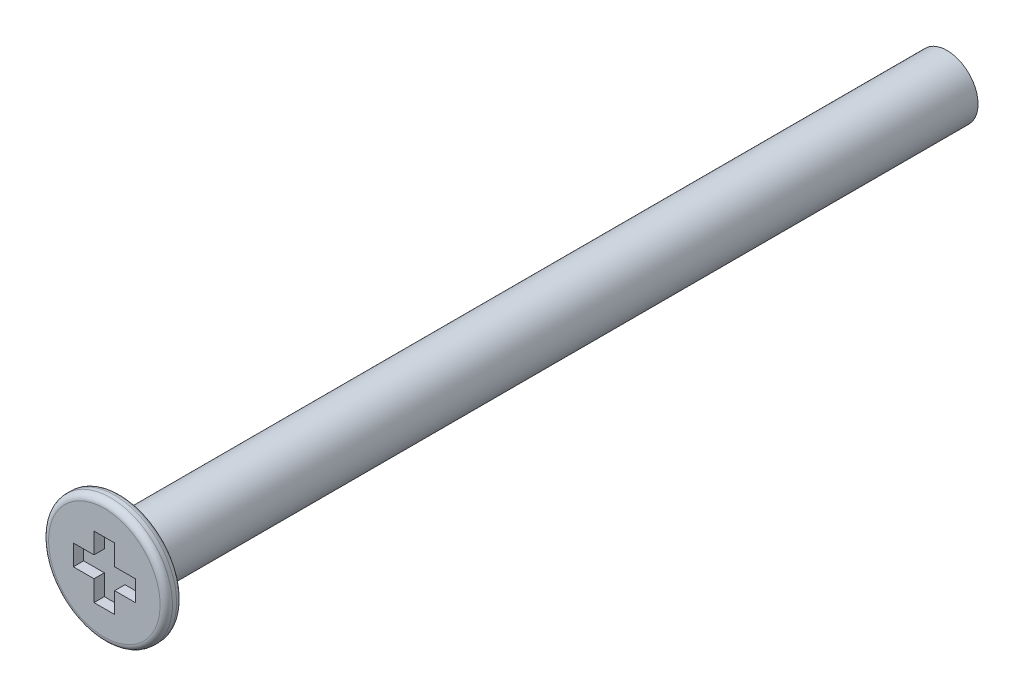
ISO-10303-21;
HEADER;
FILE_DESCRIPTION(('STEP AP214'),'2;1');
FILE_NAME('part.step','',(''),(''),'','','');
FILE_SCHEMA(('AUTOMOTIVE_DESIGN { 1 0 10303 214 1 1 1 1 }'));
ENDSEC;
DATA;
#1=APPLICATION_CONTEXT('core data for automotive mechanical design processes');
#2=APPLICATION_PROTOCOL_DEFINITION('international standard','automotive_design',2000,#1);
#3=PRODUCT_CONTEXT('',#1,'mechanical');
#4=PRODUCT('Part','Part','',(#3));
#5=PRODUCT_RELATED_PRODUCT_CATEGORY('part','',(#4));
#6=PRODUCT_DEFINITION_FORMATION('','',#4);
#7=PRODUCT_DEFINITION_CONTEXT('part definition',#1,'design');
#8=PRODUCT_DEFINITION('design','',#6,#7);
#9=PRODUCT_DEFINITION_SHAPE('','',#8);
#10=(LENGTH_UNIT() NAMED_UNIT(*) SI_UNIT(.MILLI.,.METRE.));
#11=(NAMED_UNIT(*) PLANE_ANGLE_UNIT() SI_UNIT($,.RADIAN.));
#12=(NAMED_UNIT(*) SI_UNIT($,.STERADIAN.) SOLID_ANGLE_UNIT());
#13=UNCERTAINTY_MEASURE_WITH_UNIT(LENGTH_MEASURE(1.E-05),#10,'distance_accuracy_value','');
#14=(GEOMETRIC_REPRESENTATION_CONTEXT(3) GLOBAL_UNCERTAINTY_ASSIGNED_CONTEXT((#13)) GLOBAL_UNIT_ASSIGNED_CONTEXT((#10,
#11,#12)) REPRESENTATION_CONTEXT('',''));
#15=CARTESIAN_POINT('',(0.,0.,0.));
#16=DIRECTION('',(0.,0.,1.));
#17=DIRECTION('',(1.,0.,0.));
#18=AXIS2_PLACEMENT_3D('',#15,#16,#17);
#19=CARTESIAN_POINT('',(0.,0.,0.3));
#20=DIRECTION('',(0.,0.,-1.));
#21=DIRECTION('',(0.,-1.,0.));
#22=AXIS2_PLACEMENT_3D('',#19,#20,#21);
#23=PLANE('',#22);
#24=DIRECTION('',(-1.,0.,0.));
#25=VECTOR('',#24,1.);
#26=CARTESIAN_POINT('',(0.499999988824129,-1.49999996647239,0.3));
#27=LINE('',#26,#25);
#28=CARTESIAN_POINT('',(0.499999988824129,-1.49999996647239,0.3));
#29=VERTEX_POINT('',#28);
#30=CARTESIAN_POINT('',(-0.499999988824129,-1.49999996647239,0.3));
#31=VERTEX_POINT('',#30);
#32=EDGE_CURVE('E11',#29,#31,#27,.T.);
#33=ORIENTED_EDGE('',*,*,#32,.F.);
#34=DIRECTION('',(0.,-1.,0.));
#35=VECTOR('',#34,1.);
#36=CARTESIAN_POINT('',(0.499999988824129,1.49999996647239,0.3));
#37=LINE('',#36,#35);
#38=CARTESIAN_POINT('',(0.499999988824129,-0.499999988824129,0.3));
#39=VERTEX_POINT('',#38);
#40=EDGE_CURVE('E274',#39,#29,#37,.T.);
#41=ORIENTED_EDGE('',*,*,#40,.F.);
#42=DIRECTION('',(-1.,0.,0.));
#43=VECTOR('',#42,1.);
#44=CARTESIAN_POINT('',(1.49999996647239,-0.499999988824129,0.3));
#45=LINE('',#44,#43);
#46=CARTESIAN_POINT('',(1.49999996647239,-0.499999988824129,0.3));
#47=VERTEX_POINT('',#46);
#48=EDGE_CURVE('E269',#47,#39,#45,.T.);
#49=ORIENTED_EDGE('',*,*,#48,.F.);
#50=DIRECTION('',(0.,-1.,0.));
#51=VECTOR('',#50,1.);
#52=CARTESIAN_POINT('',(1.49999996647239,0.499999988824129,0.3));
#53=LINE('',#52,#51);
#54=CARTESIAN_POINT('',(1.49999996647239,0.499999988824129,0.3));
#55=VERTEX_POINT('',#54);
#56=EDGE_CURVE('E201',#55,#47,#53,.T.);
#57=ORIENTED_EDGE('',*,*,#56,.F.);
#58=DIRECTION('',(1.,0.,0.));
#59=VECTOR('',#58,1.);
#60=CARTESIAN_POINT('',(-1.49999996647239,0.499999988824129,0.3));
#61=LINE('',#60,#59);
#62=CARTESIAN_POINT('',(0.499999988824129,0.499999988824129,0.3));
#63=VERTEX_POINT('',#62);
#64=EDGE_CURVE('E249',#63,#55,#61,.T.);
#65=ORIENTED_EDGE('',*,*,#64,.F.);
#66=DIRECTION('',(0.,-1.,0.));
#67=VECTOR('',#66,1.);
#68=CARTESIAN_POINT('',(0.499999988824129,1.49999996647239,0.3));
#69=LINE('',#68,#67);
#70=CARTESIAN_POINT('',(0.499999988824129,1.49999996647239,0.3));
#71=VERTEX_POINT('',#70);
#72=EDGE_CURVE('E298',#71,#63,#69,.T.);
#73=ORIENTED_EDGE('',*,*,#72,.F.);
#74=DIRECTION('',(1.,0.,0.));
#75=VECTOR('',#74,1.);
#76=CARTESIAN_POINT('',(-0.499999988824129,1.49999996647239,0.3));
#77=LINE('',#76,#75);
#78=CARTESIAN_POINT('',(-0.499999988824129,1.49999996647239,0.3));
#79=VERTEX_POINT('',#78);
#80=EDGE_CURVE('E305',#79,#71,#77,.T.);
#81=ORIENTED_EDGE('',*,*,#80,.F.);
#82=DIRECTION('',(0.,1.,0.));
#83=VECTOR('',#82,1.);
#84=CARTESIAN_POINT('',(-0.499999988824129,-1.49999996647239,0.3));
#85=LINE('',#84,#83);
#86=CARTESIAN_POINT('',(-0.499999988824129,0.499999988824129,0.3));
#87=VERTEX_POINT('',#86);
#88=EDGE_CURVE('E312',#87,#79,#85,.T.);
#89=ORIENTED_EDGE('',*,*,#88,.F.);
#90=DIRECTION('',(1.,0.,0.));
#91=VECTOR('',#90,1.);
#92=CARTESIAN_POINT('',(-1.49999996647239,0.499999988824129,0.3));
#93=LINE('',#92,#91);
#94=CARTESIAN_POINT('',(-1.49999996647239,0.499999988824129,0.3));
#95=VERTEX_POINT('',#94);
#96=EDGE_CURVE('E225',#95,#87,#93,.T.);
#97=ORIENTED_EDGE('',*,*,#96,.F.);
#98=DIRECTION('',(0.,1.,0.));
#99=VECTOR('',#98,1.);
#100=CARTESIAN_POINT('',(-1.49999996647239,-0.499999988824129,0.3));
#101=LINE('',#100,#99);
#102=CARTESIAN_POINT('',(-1.49999996647239,-0.499999988824129,0.3));
#103=VERTEX_POINT('',#102);
#104=EDGE_CURVE('E224',#103,#95,#101,.T.);
#105=ORIENTED_EDGE('',*,*,#104,.F.);
#106=DIRECTION('',(-1.,0.,0.));
#107=VECTOR('',#106,1.);
#108=CARTESIAN_POINT('',(1.49999996647239,-0.499999988824129,0.3));
#109=LINE('',#108,#107);
#110=CARTESIAN_POINT('',(-0.499999988824129,-0.499999988824129,0.3));
#111=VERTEX_POINT('',#110);
#112=EDGE_CURVE('E284',#111,#103,#109,.T.);
#113=ORIENTED_EDGE('',*,*,#112,.F.);
#114=DIRECTION('',(0.,1.,0.));
#115=VECTOR('',#114,1.);
#116=CARTESIAN_POINT('',(-0.499999988824129,-1.49999996647239,0.3));
#117=LINE('',#116,#115);
#118=EDGE_CURVE('E27',#31,#111,#117,.T.);
#119=ORIENTED_EDGE('',*,*,#118,.F.);
#120=EDGE_LOOP('',(#33,#41,#49,#57,#65,#73,#81,#89,#97,#105,#113,#119));
#121=FACE_BOUND('',#120,.T.);
#122=ADVANCED_FACE('F17',(#121),#23,.F.);
#123=CARTESIAN_POINT('',(0.499999988824129,-1.49999996647239,0.8));
#124=DIRECTION('',(0.,-1.,0.));
#125=DIRECTION('',(0.,0.,-1.));
#126=AXIS2_PLACEMENT_3D('',#123,#124,#125);
#127=PLANE('',#126);
#128=DIRECTION('',(-1.,0.,0.));
#129=VECTOR('',#128,1.);
#130=CARTESIAN_POINT('',(0.249999994412065,-1.49999996647239,0.8));
#131=LINE('',#130,#129);
#132=CARTESIAN_POINT('',(0.499999988824129,-1.49999996647239,0.8));
#133=VERTEX_POINT('',#132);
#134=CARTESIAN_POINT('',(-0.499999988824129,-1.49999996647239,0.8));
#135=VERTEX_POINT('',#134);
#136=EDGE_CURVE('E190',#133,#135,#131,.T.);
#137=ORIENTED_EDGE('',*,*,#136,.F.);
#138=DIRECTION('',(0.,0.,-1.));
#139=VECTOR('',#138,1.);
#140=CARTESIAN_POINT('',(0.499999988824129,-1.49999996647239,0.8));
#141=LINE('',#140,#139);
#142=EDGE_CURVE('E270',#133,#29,#141,.T.);
#143=ORIENTED_EDGE('',*,*,#142,.T.);
#144=ORIENTED_EDGE('',*,*,#32,.T.);
#145=DIRECTION('',(0.,0.,-1.));
#146=VECTOR('',#145,1.);
#147=CARTESIAN_POINT('',(-0.499999988824129,-1.49999996647239,0.8));
#148=LINE('',#147,#146);
#149=EDGE_CURVE('E21',#135,#31,#148,.T.);
#150=ORIENTED_EDGE('',*,*,#149,.F.);
#151=EDGE_LOOP('',(#137,#143,#144,#150));
#152=FACE_BOUND('',#151,.T.);
#153=ADVANCED_FACE('F19',(#152),#127,.F.);
#154=CARTESIAN_POINT('',(-0.499999988824129,-1.49999996647239,0.8));
#155=DIRECTION('',(-1.,0.,0.));
#156=DIRECTION('',(0.,0.,1.));
#157=AXIS2_PLACEMENT_3D('',#154,#155,#156);
#158=PLANE('',#157);
#159=DIRECTION('',(0.,1.,0.));
#160=VECTOR('',#159,1.);
#161=CARTESIAN_POINT('',(-0.499999988824129,-0.749999983236194,0.8));
#162=LINE('',#161,#160);
#163=CARTESIAN_POINT('',(-0.499999988824129,-0.499999988824129,0.8));
#164=VERTEX_POINT('',#163);
#165=EDGE_CURVE('E194',#135,#164,#162,.T.);
#166=ORIENTED_EDGE('',*,*,#165,.F.);
#167=ORIENTED_EDGE('',*,*,#149,.T.);
#168=ORIENTED_EDGE('',*,*,#118,.T.);
#169=DIRECTION('',(0.,0.,-1.));
#170=VECTOR('',#169,1.);
#171=CARTESIAN_POINT('',(-0.499999988824129,-0.499999988824129,0.8));
#172=LINE('',#171,#170);
#173=EDGE_CURVE('E280',#164,#111,#172,.T.);
#174=ORIENTED_EDGE('',*,*,#173,.F.);
#175=EDGE_LOOP('',(#166,#167,#168,#174));
#176=FACE_BOUND('',#175,.T.);
#177=ADVANCED_FACE('F331',(#176),#158,.F.);
#178=CARTESIAN_POINT('',(-0.499999988824129,-0.499999988824129,0.8));
#179=DIRECTION('',(0.,-1.,0.));
#180=DIRECTION('',(0.,0.,-1.));
#181=AXIS2_PLACEMENT_3D('',#178,#179,#180);
#182=PLANE('',#181);
#183=DIRECTION('',(-1.,0.,0.));
#184=VECTOR('',#183,1.);
#185=CARTESIAN_POINT('',(-0.249999994412065,-0.499999988824129,0.8));
#186=LINE('',#185,#184);
#187=CARTESIAN_POINT('',(-1.49999996647239,-0.499999988824129,0.8));
#188=VERTEX_POINT('',#187);
#189=EDGE_CURVE('E197',#164,#188,#186,.T.);
#190=ORIENTED_EDGE('',*,*,#189,.F.);
#191=ORIENTED_EDGE('',*,*,#173,.T.);
#192=ORIENTED_EDGE('',*,*,#112,.T.);
#193=DIRECTION('',(0.,0.,-1.));
#194=VECTOR('',#193,1.);
#195=CARTESIAN_POINT('',(-1.49999996647239,-0.499999988824129,0.8));
#196=LINE('',#195,#194);
#197=EDGE_CURVE('E220',#188,#103,#196,.T.);
#198=ORIENTED_EDGE('',*,*,#197,.F.);
#199=EDGE_LOOP('',(#190,#191,#192,#198));
#200=FACE_BOUND('',#199,.T.);
#201=ADVANCED_FACE('F478',(#200),#182,.F.);
#202=CARTESIAN_POINT('',(-1.49999996647239,-0.499999988824129,0.8));
#203=DIRECTION('',(-1.,0.,0.));
#204=DIRECTION('',(0.,0.,1.));
#205=AXIS2_PLACEMENT_3D('',#202,#203,#204);
#206=PLANE('',#205);
#207=DIRECTION('',(0.,1.,0.));
#208=VECTOR('',#207,1.);
#209=CARTESIAN_POINT('',(-1.49999996647239,-0.249999994412065,0.8));
#210=LINE('',#209,#208);
#211=CARTESIAN_POINT('',(-1.49999996647239,0.499999988824129,0.8));
#212=VERTEX_POINT('',#211);
#213=EDGE_CURVE('E183',#188,#212,#210,.T.);
#214=ORIENTED_EDGE('',*,*,#213,.F.);
#215=ORIENTED_EDGE('',*,*,#197,.T.);
#216=ORIENTED_EDGE('',*,*,#104,.T.);
#217=DIRECTION('',(0.,0.,-1.));
#218=VECTOR('',#217,1.);
#219=CARTESIAN_POINT('',(-1.49999996647239,0.499999988824129,0.8));
#220=LINE('',#219,#218);
#221=EDGE_CURVE('E315',#212,#95,#220,.T.);
#222=ORIENTED_EDGE('',*,*,#221,.F.);
#223=EDGE_LOOP('',(#214,#215,#216,#222));
#224=FACE_BOUND('',#223,.T.);
#225=ADVANCED_FACE('F472',(#224),#206,.F.);
#226=CARTESIAN_POINT('',(-1.49999996647239,0.499999988824129,0.8));
#227=DIRECTION('',(0.,1.,0.));
#228=DIRECTION('',(1.,0.,0.));
#229=AXIS2_PLACEMENT_3D('',#226,#227,#228);
#230=PLANE('',#229);
#231=DIRECTION('',(1.,0.,0.));
#232=VECTOR('',#231,1.);
#233=CARTESIAN_POINT('',(-0.749999983236194,0.499999988824129,0.8));
#234=LINE('',#233,#232);
#235=CARTESIAN_POINT('',(-0.499999988824129,0.499999988824129,0.8));
#236=VERTEX_POINT('',#235);
#237=EDGE_CURVE('E178',#212,#236,#234,.T.);
#238=ORIENTED_EDGE('',*,*,#237,.F.);
#239=ORIENTED_EDGE('',*,*,#221,.T.);
#240=ORIENTED_EDGE('',*,*,#96,.T.);
#241=DIRECTION('',(0.,0.,-1.));
#242=VECTOR('',#241,1.);
#243=CARTESIAN_POINT('',(-0.499999988824129,0.499999988824129,0.8));
#244=LINE('',#243,#242);
#245=EDGE_CURVE('E308',#236,#87,#244,.T.);
#246=ORIENTED_EDGE('',*,*,#245,.F.);
#247=EDGE_LOOP('',(#238,#239,#240,#246));
#248=FACE_BOUND('',#247,.T.);
#249=ADVANCED_FACE('F477',(#248),#230,.F.);
#250=CARTESIAN_POINT('',(-0.499999988824129,0.499999988824129,0.8));
#251=DIRECTION('',(-1.,0.,0.));
#252=DIRECTION('',(0.,0.,1.));
#253=AXIS2_PLACEMENT_3D('',#250,#251,#252);
#254=PLANE('',#253);
#255=DIRECTION('',(0.,1.,0.));
#256=VECTOR('',#255,1.);
#257=CARTESIAN_POINT('',(-0.499999988824129,0.249999994412065,0.8));
#258=LINE('',#257,#256);
#259=CARTESIAN_POINT('',(-0.499999988824129,1.49999996647239,0.8));
#260=VERTEX_POINT('',#259);
#261=EDGE_CURVE('E182',#236,#260,#258,.T.);
#262=ORIENTED_EDGE('',*,*,#261,.F.);
#263=ORIENTED_EDGE('',*,*,#245,.T.);
#264=ORIENTED_EDGE('',*,*,#88,.T.);
#265=DIRECTION('',(0.,0.,-1.));
#266=VECTOR('',#265,1.);
#267=CARTESIAN_POINT('',(-0.499999988824129,1.49999996647239,0.8));
#268=LINE('',#267,#266);
#269=EDGE_CURVE('E301',#260,#79,#268,.T.);
#270=ORIENTED_EDGE('',*,*,#269,.F.);
#271=EDGE_LOOP('',(#262,#263,#264,#270));
#272=FACE_BOUND('',#271,.T.);
#273=ADVANCED_FACE('F521',(#272),#254,.F.);
#274=CARTESIAN_POINT('',(-0.499999988824129,1.49999996647239,0.8));
#275=DIRECTION('',(0.,1.,0.));
#276=DIRECTION('',(1.,0.,0.));
#277=AXIS2_PLACEMENT_3D('',#274,#275,#276);
#278=PLANE('',#277);
#279=DIRECTION('',(1.,0.,0.));
#280=VECTOR('',#279,1.);
#281=CARTESIAN_POINT('',(-0.249999994412065,1.49999996647239,0.8));
#282=LINE('',#281,#280);
#283=CARTESIAN_POINT('',(0.499999988824129,1.49999996647239,0.8));
#284=VERTEX_POINT('',#283);
#285=EDGE_CURVE('E240',#260,#284,#282,.T.);
#286=ORIENTED_EDGE('',*,*,#285,.F.);
#287=ORIENTED_EDGE('',*,*,#269,.T.);
#288=ORIENTED_EDGE('',*,*,#80,.T.);
#289=DIRECTION('',(0.,0.,-1.));
#290=VECTOR('',#289,1.);
#291=CARTESIAN_POINT('',(0.499999988824129,1.49999996647239,0.8));
#292=LINE('',#291,#290);
#293=EDGE_CURVE('E252',#284,#71,#292,.T.);
#294=ORIENTED_EDGE('',*,*,#293,.F.);
#295=EDGE_LOOP('',(#286,#287,#288,#294));
#296=FACE_BOUND('',#295,.T.);
#297=ADVANCED_FACE('F552',(#296),#278,.F.);
#298=CARTESIAN_POINT('',(0.499999988824129,1.49999996647239,0.8));
#299=DIRECTION('',(1.,0.,0.));
#300=DIRECTION('',(0.,1.,0.));
#301=AXIS2_PLACEMENT_3D('',#298,#299,#300);
#302=PLANE('',#301);
#303=DIRECTION('',(0.,-1.,0.));
#304=VECTOR('',#303,1.);
#305=CARTESIAN_POINT('',(0.499999988824129,0.749999983236194,0.8));
#306=LINE('',#305,#304);
#307=CARTESIAN_POINT('',(0.499999988824129,0.499999988824129,0.8));
#308=VERTEX_POINT('',#307);
#309=EDGE_CURVE('E243',#284,#308,#306,.T.);
#310=ORIENTED_EDGE('',*,*,#309,.F.);
#311=ORIENTED_EDGE('',*,*,#293,.T.);
#312=ORIENTED_EDGE('',*,*,#72,.T.);
#313=DIRECTION('',(0.,0.,-1.));
#314=VECTOR('',#313,1.);
#315=CARTESIAN_POINT('',(0.499999988824129,0.499999988824129,0.8));
#316=LINE('',#315,#314);
#317=EDGE_CURVE('E204',#308,#63,#316,.T.);
#318=ORIENTED_EDGE('',*,*,#317,.F.);
#319=EDGE_LOOP('',(#310,#311,#312,#318));
#320=FACE_BOUND('',#319,.T.);
#321=ADVANCED_FACE('F569',(#320),#302,.F.);
#322=CARTESIAN_POINT('',(0.499999988824129,0.499999988824129,0.8));
#323=DIRECTION('',(0.,1.,0.));
#324=DIRECTION('',(1.,0.,0.));
#325=AXIS2_PLACEMENT_3D('',#322,#323,#324);
#326=PLANE('',#325);
#327=DIRECTION('',(1.,0.,0.));
#328=VECTOR('',#327,1.);
#329=CARTESIAN_POINT('',(0.249999994412065,0.499999988824129,0.8));
#330=LINE('',#329,#328);
#331=CARTESIAN_POINT('',(1.49999996647239,0.499999988824129,0.8));
#332=VERTEX_POINT('',#331);
#333=EDGE_CURVE('E248',#308,#332,#330,.T.);
#334=ORIENTED_EDGE('',*,*,#333,.F.);
#335=ORIENTED_EDGE('',*,*,#317,.T.);
#336=ORIENTED_EDGE('',*,*,#64,.T.);
#337=DIRECTION('',(0.,0.,-1.));
#338=VECTOR('',#337,1.);
#339=CARTESIAN_POINT('',(1.49999996647239,0.499999988824129,0.8));
#340=LINE('',#339,#338);
#341=EDGE_CURVE('E205',#332,#55,#340,.T.);
#342=ORIENTED_EDGE('',*,*,#341,.F.);
#343=EDGE_LOOP('',(#334,#335,#336,#342));
#344=FACE_BOUND('',#343,.T.);
#345=ADVANCED_FACE('F533',(#344),#326,.F.);
#346=CARTESIAN_POINT('',(1.49999996647239,0.499999988824129,0.8));
#347=DIRECTION('',(1.,0.,0.));
#348=DIRECTION('',(0.,1.,0.));
#349=AXIS2_PLACEMENT_3D('',#346,#347,#348);
#350=PLANE('',#349);
#351=DIRECTION('',(0.,-1.,0.));
#352=VECTOR('',#351,1.);
#353=CARTESIAN_POINT('',(1.49999996647239,0.249999994412065,0.8));
#354=LINE('',#353,#352);
#355=CARTESIAN_POINT('',(1.49999996647239,-0.499999988824129,0.8));
#356=VERTEX_POINT('',#355);
#357=EDGE_CURVE('E256',#332,#356,#354,.T.);
#358=ORIENTED_EDGE('',*,*,#357,.F.);
#359=ORIENTED_EDGE('',*,*,#341,.T.);
#360=ORIENTED_EDGE('',*,*,#56,.T.);
#361=DIRECTION('',(0.,0.,-1.));
#362=VECTOR('',#361,1.);
#363=CARTESIAN_POINT('',(1.49999996647239,-0.499999988824129,0.8));
#364=LINE('',#363,#362);
#365=EDGE_CURVE('E265',#356,#47,#364,.T.);
#366=ORIENTED_EDGE('',*,*,#365,.F.);
#367=EDGE_LOOP('',(#358,#359,#360,#366));
#368=FACE_BOUND('',#367,.T.);
#369=ADVANCED_FACE('F527',(#368),#350,.F.);
#370=CARTESIAN_POINT('',(1.49999996647239,-0.499999988824129,0.8));
#371=DIRECTION('',(0.,-1.,0.));
#372=DIRECTION('',(0.,0.,-1.));
#373=AXIS2_PLACEMENT_3D('',#370,#371,#372);
#374=PLANE('',#373);
#375=DIRECTION('',(-1.,0.,0.));
#376=VECTOR('',#375,1.);
#377=CARTESIAN_POINT('',(0.749999983236194,-0.499999988824129,0.8));
#378=LINE('',#377,#376);
#379=CARTESIAN_POINT('',(0.499999988824129,-0.499999988824129,0.8));
#380=VERTEX_POINT('',#379);
#381=EDGE_CURVE('E260',#356,#380,#378,.T.);
#382=ORIENTED_EDGE('',*,*,#381,.F.);
#383=ORIENTED_EDGE('',*,*,#365,.T.);
#384=ORIENTED_EDGE('',*,*,#48,.T.);
#385=DIRECTION('',(0.,0.,-1.));
#386=VECTOR('',#385,1.);
#387=CARTESIAN_POINT('',(0.499999988824129,-0.499999988824129,0.8));
#388=LINE('',#387,#386);
#389=EDGE_CURVE('E264',#380,#39,#388,.T.);
#390=ORIENTED_EDGE('',*,*,#389,.F.);
#391=EDGE_LOOP('',(#382,#383,#384,#390));
#392=FACE_BOUND('',#391,.T.);
#393=ADVANCED_FACE('F532',(#392),#374,.F.);
#394=CARTESIAN_POINT('',(0.499999988824129,-0.499999988824129,0.8));
#395=DIRECTION('',(1.,0.,0.));
#396=DIRECTION('',(0.,1.,0.));
#397=AXIS2_PLACEMENT_3D('',#394,#395,#396);
#398=PLANE('',#397);
#399=DIRECTION('',(0.,-1.,0.));
#400=VECTOR('',#399,1.);
#401=CARTESIAN_POINT('',(0.499999988824129,-0.249999994412065,0.8));
#402=LINE('',#401,#400);
#403=EDGE_CURVE('E177',#380,#133,#402,.T.);
#404=ORIENTED_EDGE('',*,*,#403,.F.);
#405=ORIENTED_EDGE('',*,*,#389,.T.);
#406=ORIENTED_EDGE('',*,*,#40,.T.);
#407=ORIENTED_EDGE('',*,*,#142,.F.);
#408=EDGE_LOOP('',(#404,#405,#406,#407));
#409=FACE_BOUND('',#408,.T.);
#410=ADVANCED_FACE('F578',(#409),#398,.F.);
#411=CARTESIAN_POINT('',(0.,0.,0.8));
#412=DIRECTION('',(0.,0.,1.));
#413=DIRECTION('',(1.,0.,0.));
#414=AXIS2_PLACEMENT_3D('',#411,#412,#413);
#415=PLANE('',#414);
#416=ORIENTED_EDGE('',*,*,#403,.T.);
#417=ORIENTED_EDGE('',*,*,#136,.T.);
#418=ORIENTED_EDGE('',*,*,#165,.T.);
#419=ORIENTED_EDGE('',*,*,#189,.T.);
#420=ORIENTED_EDGE('',*,*,#213,.T.);
#421=ORIENTED_EDGE('',*,*,#237,.T.);
#422=ORIENTED_EDGE('',*,*,#261,.T.);
#423=ORIENTED_EDGE('',*,*,#285,.T.);
#424=ORIENTED_EDGE('',*,*,#309,.T.);
#425=ORIENTED_EDGE('',*,*,#333,.T.);
#426=ORIENTED_EDGE('',*,*,#357,.T.);
#427=ORIENTED_EDGE('',*,*,#381,.T.);
#428=EDGE_LOOP('',(#416,#417,#418,#419,#420,#421,#422,#423,#424,#425,#426,#427));
#429=FACE_BOUND('',#428,.T.);
#430=CARTESIAN_POINT('',(0.,0.,0.8));
#431=DIRECTION('',(0.,0.,-1.));
#432=DIRECTION('',(1.,0.,0.));
#433=AXIS2_PLACEMENT_3D('',#430,#431,#432);
#434=CIRCLE('',#433,2.7);
#435=CARTESIAN_POINT('',(-2.7,0.,0.8));
#436=VERTEX_POINT('',#435);
#437=EDGE_CURVE('E209',#436,#436,#434,.T.);
#438=ORIENTED_EDGE('',*,*,#437,.F.);
#439=EDGE_LOOP('',(#438));
#440=FACE_BOUND('',#439,.T.);
#441=ADVANCED_FACE('F336',(#429,#440),#415,.T.);
#442=CARTESIAN_POINT('',(0.,0.,0.5));
#443=DIRECTION('',(0.,0.,1.));
#444=DIRECTION('',(1.,0.,0.));
#445=AXIS2_PLACEMENT_3D('',#442,#443,#444);
#446=TOROIDAL_SURFACE('',#445,2.7,0.3);
#447=ORIENTED_EDGE('',*,*,#437,.T.);
#448=CARTESIAN_POINT('',(-2.7,0.,0.5));
#449=DIRECTION('',(0.,-1.,0.));
#450=DIRECTION('',(-1.,0.,0.));
#451=AXIS2_PLACEMENT_3D('',#448,#449,#450);
#452=CIRCLE('',#451,0.3);
#453=CARTESIAN_POINT('',(-3.,0.,0.5));
#454=VERTEX_POINT('',#453);
#455=EDGE_CURVE('E206',#436,#454,#452,.T.);
#456=ORIENTED_EDGE('',*,*,#455,.T.);
#457=CARTESIAN_POINT('',(0.,0.,0.5));
#458=DIRECTION('',(0.,0.,1.));
#459=DIRECTION('',(1.,0.,0.));
#460=AXIS2_PLACEMENT_3D('',#457,#458,#459);
#461=CIRCLE('',#460,3.);
#462=EDGE_CURVE('E216',#454,#454,#461,.T.);
#463=ORIENTED_EDGE('',*,*,#462,.T.);
#464=ORIENTED_EDGE('',*,*,#455,.F.);
#465=EDGE_LOOP('',(#447,#456,#463,#464));
#466=FACE_BOUND('',#465,.T.);
#467=ADVANCED_FACE('F543',(#466),#446,.T.);
#468=CARTESIAN_POINT('',(0.,0.,0.));
#469=DIRECTION('',(0.,0.,1.));
#470=DIRECTION('',(1.,0.,0.));
#471=AXIS2_PLACEMENT_3D('',#468,#469,#470);
#472=PLANE('',#471);
#473=CARTESIAN_POINT('',(0.,0.,0.));
#474=DIRECTION('',(0.,0.,1.));
#475=DIRECTION('',(1.,0.,0.));
#476=AXIS2_PLACEMENT_3D('',#473,#474,#475);
#477=CIRCLE('',#476,1.5);
#478=CARTESIAN_POINT('',(-1.5,0.,0.));
#479=VERTEX_POINT('',#478);
#480=EDGE_CURVE('E165',#479,#479,#477,.T.);
#481=ORIENTED_EDGE('',*,*,#480,.T.);
#482=EDGE_LOOP('',(#481));
#483=FACE_BOUND('',#482,.T.);
#484=CARTESIAN_POINT('',(0.,0.,0.));
#485=DIRECTION('',(0.,0.,1.));
#486=DIRECTION('',(1.,0.,0.));
#487=AXIS2_PLACEMENT_3D('',#484,#485,#486);
#488=CIRCLE('',#487,2.7);
#489=CARTESIAN_POINT('',(-2.7,0.,0.));
#490=VERTEX_POINT('',#489);
#491=EDGE_CURVE('E188',#490,#490,#488,.T.);
#492=ORIENTED_EDGE('',*,*,#491,.F.);
#493=EDGE_LOOP('',(#492));
#494=FACE_BOUND('',#493,.T.);
#495=ADVANCED_FACE('F512',(#483,#494),#472,.F.);
#496=CARTESIAN_POINT('',(0.,0.,0.));
#497=DIRECTION('',(0.,0.,1.));
#498=DIRECTION('',(1.,0.,0.));
#499=AXIS2_PLACEMENT_3D('',#496,#497,#498);
#500=CYLINDRICAL_SURFACE('',#499,3.);
#501=ORIENTED_EDGE('',*,*,#462,.F.);
#502=DIRECTION('',(0.,0.,-1.));
#503=VECTOR('',#502,1.);
#504=CARTESIAN_POINT('',(-3.,0.,0.));
#505=LINE('',#504,#503);
#506=CARTESIAN_POINT('',(-3.,0.,0.3));
#507=VERTEX_POINT('',#506);
#508=EDGE_CURVE('E213',#454,#507,#505,.T.);
#509=ORIENTED_EDGE('',*,*,#508,.T.);
#510=CARTESIAN_POINT('',(0.,0.,0.3));
#511=DIRECTION('',(0.,0.,-1.));
#512=DIRECTION('',(1.,0.,0.));
#513=AXIS2_PLACEMENT_3D('',#510,#511,#512);
#514=CIRCLE('',#513,3.);
#515=EDGE_CURVE('E189',#507,#507,#514,.T.);
#516=ORIENTED_EDGE('',*,*,#515,.F.);
#517=ORIENTED_EDGE('',*,*,#508,.F.);
#518=EDGE_LOOP('',(#501,#509,#516,#517));
#519=FACE_BOUND('',#518,.T.);
#520=ADVANCED_FACE('F503',(#519),#500,.T.);
#521=CARTESIAN_POINT('',(0.,0.,0.3));
#522=DIRECTION('',(0.,0.,1.));
#523=DIRECTION('',(1.,0.,0.));
#524=AXIS2_PLACEMENT_3D('',#521,#522,#523);
#525=TOROIDAL_SURFACE('',#524,2.7,0.3);
#526=ORIENTED_EDGE('',*,*,#515,.T.);
#527=CARTESIAN_POINT('',(-2.7,0.,0.3));
#528=DIRECTION('',(0.,-1.,0.));
#529=DIRECTION('',(-1.,0.,0.));
#530=AXIS2_PLACEMENT_3D('',#527,#528,#529);
#531=CIRCLE('',#530,0.3);
#532=EDGE_CURVE('E184',#507,#490,#531,.T.);
#533=ORIENTED_EDGE('',*,*,#532,.T.);
#534=ORIENTED_EDGE('',*,*,#491,.T.);
#535=ORIENTED_EDGE('',*,*,#532,.F.);
#536=EDGE_LOOP('',(#526,#533,#534,#535));
#537=FACE_BOUND('',#536,.T.);
#538=ADVANCED_FACE('F495',(#537),#525,.T.);
#539=CARTESIAN_POINT('',(0.,0.,0.));
#540=DIRECTION('',(0.,0.,-1.));
#541=DIRECTION('',(1.,0.,0.));
#542=AXIS2_PLACEMENT_3D('',#539,#540,#541);
#543=CYLINDRICAL_SURFACE('',#542,1.5);
#544=CARTESIAN_POINT('',(0.,0.,-40.));
#545=DIRECTION('',(0.,0.,-1.));
#546=DIRECTION('',(1.,0.,0.));
#547=AXIS2_PLACEMENT_3D('',#544,#545,#546);
#548=CIRCLE('',#547,1.5);
#549=CARTESIAN_POINT('',(-1.5,0.,-40.));
#550=VERTEX_POINT('',#549);
#551=EDGE_CURVE('E164',#550,#550,#548,.T.);
#552=ORIENTED_EDGE('',*,*,#551,.F.);
#553=DIRECTION('',(0.,0.,1.));
#554=VECTOR('',#553,1.);
#555=CARTESIAN_POINT('',(-1.5,0.,0.));
#556=LINE('',#555,#554);
#557=EDGE_CURVE('E161',#550,#479,#556,.T.);
#558=ORIENTED_EDGE('',*,*,#557,.T.);
#559=ORIENTED_EDGE('',*,*,#480,.F.);
#560=ORIENTED_EDGE('',*,*,#557,.F.);
#561=EDGE_LOOP('',(#552,#558,#559,#560));
#562=FACE_BOUND('',#561,.T.);
#563=ADVANCED_FACE('F163',(#562),#543,.T.);
#564=CARTESIAN_POINT('',(0.,0.,-40.));
#565=DIRECTION('',(0.,0.,-1.));
#566=DIRECTION('',(0.,-1.,0.));
#567=AXIS2_PLACEMENT_3D('',#564,#565,#566);
#568=PLANE('',#567);
#569=ORIENTED_EDGE('',*,*,#551,.T.);
#570=EDGE_LOOP('',(#569));
#571=FACE_BOUND('',#570,.T.);
#572=ADVANCED_FACE('F169',(#571),#568,.T.);
#573=CLOSED_SHELL('',(#122,#153,#177,#201,#225,#249,#273,#297,#321,#345,#369,#393,#410,#441,
#467,#495,#520,#538,#563,#572));
#574=MANIFOLD_SOLID_BREP('B1',#573);
#575=ADVANCED_BREP_SHAPE_REPRESENTATION('',(#18,#574),#14);
#576=SHAPE_DEFINITION_REPRESENTATION(#9,#575);
ENDSEC;
END-ISO-10303-21;
